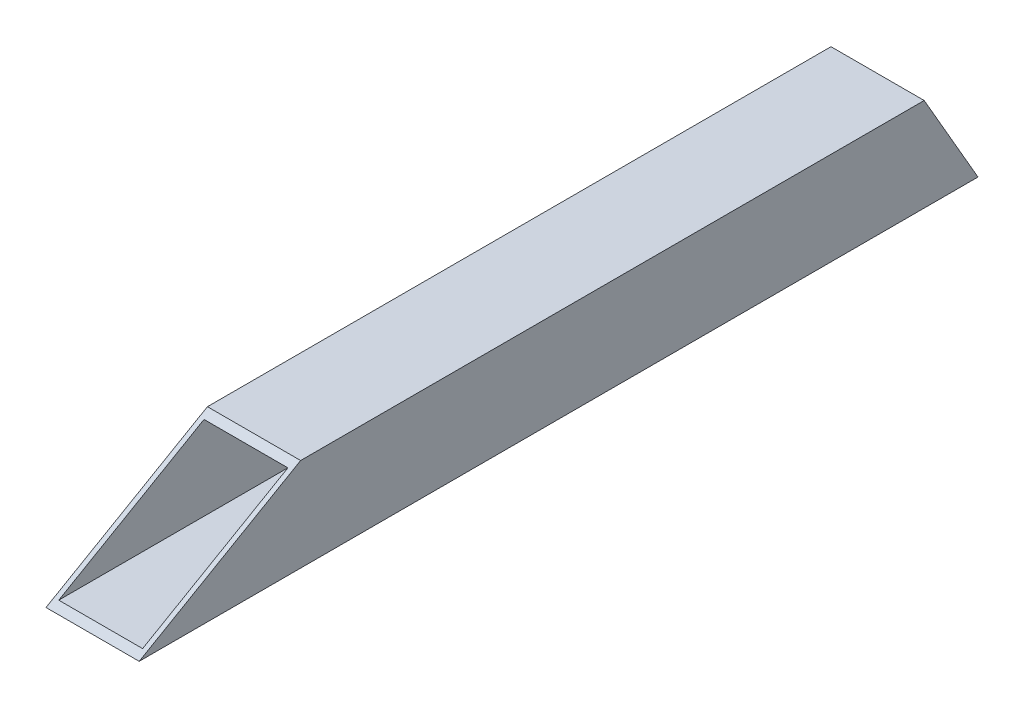
ISO-10303-21;
HEADER;
FILE_DESCRIPTION(('STEP AP214'),'2;1');
FILE_NAME('part.step','',(''),(''),'','','');
FILE_SCHEMA(('AUTOMOTIVE_DESIGN { 1 0 10303 214 1 1 1 1 }'));
ENDSEC;
DATA;
#1=APPLICATION_CONTEXT('core data for automotive mechanical design processes');
#2=APPLICATION_PROTOCOL_DEFINITION('international standard','automotive_design',2000,#1);
#3=PRODUCT_CONTEXT('',#1,'mechanical');
#4=PRODUCT('Part','Part','',(#3));
#5=PRODUCT_RELATED_PRODUCT_CATEGORY('part','',(#4));
#6=PRODUCT_DEFINITION_FORMATION('','',#4);
#7=PRODUCT_DEFINITION_CONTEXT('part definition',#1,'design');
#8=PRODUCT_DEFINITION('design','',#6,#7);
#9=PRODUCT_DEFINITION_SHAPE('','',#8);
#10=(LENGTH_UNIT() NAMED_UNIT(*) SI_UNIT(.MILLI.,.METRE.));
#11=(NAMED_UNIT(*) PLANE_ANGLE_UNIT() SI_UNIT($,.RADIAN.));
#12=(NAMED_UNIT(*) SI_UNIT($,.STERADIAN.) SOLID_ANGLE_UNIT());
#13=UNCERTAINTY_MEASURE_WITH_UNIT(LENGTH_MEASURE(1.E-05),#10,'distance_accuracy_value','');
#14=(GEOMETRIC_REPRESENTATION_CONTEXT(3) GLOBAL_UNCERTAINTY_ASSIGNED_CONTEXT((#13)) GLOBAL_UNIT_ASSIGNED_CONTEXT((#10,
#11,#12)) REPRESENTATION_CONTEXT('',''));
#15=CARTESIAN_POINT('',(0.,0.,0.));
#16=DIRECTION('',(0.,0.,1.));
#17=DIRECTION('',(1.,0.,0.));
#18=AXIS2_PLACEMENT_3D('',#15,#16,#17);
#19=CARTESIAN_POINT('',(1.,19.,180.));
#20=DIRECTION('',(0.,-1.,0.));
#21=DIRECTION('',(0.,0.,-1.));
#22=AXIS2_PLACEMENT_3D('',#19,#20,#21);
#23=PLANE('',#22);
#24=DIRECTION('',(1.,0.,0.));
#25=VECTOR('',#24,1.);
#26=CARTESIAN_POINT('',(1.,19.,147.091034656192));
#27=LINE('',#26,#25);
#28=CARTESIAN_POINT('',(1.,19.,147.091034656192));
#29=VERTEX_POINT('',#28);
#30=CARTESIAN_POINT('',(19.,19.,147.091034656192));
#31=VERTEX_POINT('',#30);
#32=EDGE_CURVE('E11',#29,#31,#27,.T.);
#33=ORIENTED_EDGE('',*,*,#32,.F.);
#34=DIRECTION('',(0.,0.,-1.));
#35=VECTOR('',#34,1.);
#36=CARTESIAN_POINT('',(1.,19.,180.));
#37=LINE('',#36,#35);
#38=CARTESIAN_POINT('',(1.,19.,10.969655114603));
#39=VERTEX_POINT('',#38);
#40=EDGE_CURVE('E143',#29,#39,#37,.T.);
#41=ORIENTED_EDGE('',*,*,#40,.T.);
#42=DIRECTION('',(-1.,0.,0.));
#43=VECTOR('',#42,1.);
#44=CARTESIAN_POINT('',(1.,19.,10.969655114603));
#45=LINE('',#44,#43);
#46=CARTESIAN_POINT('',(19.,19.,10.9696551146031));
#47=VERTEX_POINT('',#46);
#48=EDGE_CURVE('E43',#47,#39,#45,.T.);
#49=ORIENTED_EDGE('',*,*,#48,.F.);
#50=DIRECTION('',(0.,0.,-1.));
#51=VECTOR('',#50,1.);
#52=CARTESIAN_POINT('',(19.,19.,180.));
#53=LINE('',#52,#51);
#54=EDGE_CURVE('E149',#31,#47,#53,.T.);
#55=ORIENTED_EDGE('',*,*,#54,.F.);
#56=EDGE_LOOP('',(#33,#41,#49,#55));
#57=FACE_BOUND('',#56,.T.);
#58=ADVANCED_FACE('F35',(#57),#23,.T.);
#59=CARTESIAN_POINT('',(19.,1.,180.));
#60=DIRECTION('',(-1.,0.,0.));
#61=DIRECTION('',(0.,0.,1.));
#62=AXIS2_PLACEMENT_3D('',#59,#60,#61);
#63=PLANE('',#62);
#64=DIRECTION('',(0.,-0.500000000000004,0.866025403784436));
#65=VECTOR('',#64,1.);
#66=CARTESIAN_POINT('',(19.,0.250000000000004,179.566987298108));
#67=LINE('',#66,#65);
#68=CARTESIAN_POINT('',(19.,1.,178.267949192431));
#69=VERTEX_POINT('',#68);
#70=EDGE_CURVE('E173',#31,#69,#67,.T.);
#71=ORIENTED_EDGE('',*,*,#70,.F.);
#72=ORIENTED_EDGE('',*,*,#54,.T.);
#73=DIRECTION('',(0.,0.866025403784436,0.500000000000005));
#74=VECTOR('',#73,1.);
#75=CARTESIAN_POINT('',(19.,78.6922863405999,45.4330127018931));
#76=LINE('',#75,#74);
#77=CARTESIAN_POINT('',(19.,1.,0.577350269189633));
#78=VERTEX_POINT('',#77);
#79=EDGE_CURVE('E133',#78,#47,#76,.T.);
#80=ORIENTED_EDGE('',*,*,#79,.F.);
#81=DIRECTION('',(0.,0.,-1.));
#82=VECTOR('',#81,1.);
#83=CARTESIAN_POINT('',(19.,1.,180.));
#84=LINE('',#83,#82);
#85=EDGE_CURVE('E151',#69,#78,#84,.T.);
#86=ORIENTED_EDGE('',*,*,#85,.F.);
#87=EDGE_LOOP('',(#71,#72,#80,#86));
#88=FACE_BOUND('',#87,.T.);
#89=ADVANCED_FACE('F183',(#88),#63,.T.);
#90=CARTESIAN_POINT('',(1.,1.,180.));
#91=DIRECTION('',(0.,1.,0.));
#92=DIRECTION('',(0.,0.,1.));
#93=AXIS2_PLACEMENT_3D('',#90,#91,#92);
#94=PLANE('',#93);
#95=DIRECTION('',(-1.,0.,0.));
#96=VECTOR('',#95,1.);
#97=CARTESIAN_POINT('',(1.,1.,178.267949192431));
#98=LINE('',#97,#96);
#99=CARTESIAN_POINT('',(1.,1.,178.267949192431));
#100=VERTEX_POINT('',#99);
#101=EDGE_CURVE('E175',#69,#100,#98,.T.);
#102=ORIENTED_EDGE('',*,*,#101,.F.);
#103=ORIENTED_EDGE('',*,*,#85,.T.);
#104=DIRECTION('',(1.,0.,0.));
#105=VECTOR('',#104,1.);
#106=CARTESIAN_POINT('',(1.,1.,0.577350269189647));
#107=LINE('',#106,#105);
#108=CARTESIAN_POINT('',(1.,1.,0.577350269189647));
#109=VERTEX_POINT('',#108);
#110=EDGE_CURVE('E146',#109,#78,#107,.T.);
#111=ORIENTED_EDGE('',*,*,#110,.F.);
#112=DIRECTION('',(0.,0.,-1.));
#113=VECTOR('',#112,1.);
#114=CARTESIAN_POINT('',(1.,1.,180.));
#115=LINE('',#114,#113);
#116=EDGE_CURVE('E145',#100,#109,#115,.T.);
#117=ORIENTED_EDGE('',*,*,#116,.F.);
#118=EDGE_LOOP('',(#102,#103,#111,#117));
#119=FACE_BOUND('',#118,.T.);
#120=ADVANCED_FACE('F180',(#119),#94,.T.);
#121=CARTESIAN_POINT('',(1.,1.,180.));
#122=DIRECTION('',(1.,0.,0.));
#123=DIRECTION('',(0.,0.,-1.));
#124=AXIS2_PLACEMENT_3D('',#121,#122,#123);
#125=PLANE('',#124);
#126=DIRECTION('',(0.,0.500000000000004,-0.866025403784436));
#127=VECTOR('',#126,1.);
#128=CARTESIAN_POINT('',(1.,0.250000000000004,179.566987298108));
#129=LINE('',#128,#127);
#130=EDGE_CURVE('E153',#100,#29,#129,.T.);
#131=ORIENTED_EDGE('',*,*,#130,.F.);
#132=ORIENTED_EDGE('',*,*,#116,.T.);
#133=DIRECTION('',(0.,-0.866025403784436,-0.500000000000005));
#134=VECTOR('',#133,1.);
#135=CARTESIAN_POINT('',(1.,78.6922863405999,45.4330127018931));
#136=LINE('',#135,#134);
#137=EDGE_CURVE('E130',#39,#109,#136,.T.);
#138=ORIENTED_EDGE('',*,*,#137,.F.);
#139=ORIENTED_EDGE('',*,*,#40,.F.);
#140=EDGE_LOOP('',(#131,#132,#138,#139));
#141=FACE_BOUND('',#140,.T.);
#142=ADVANCED_FACE('F142',(#141),#125,.T.);
#143=CARTESIAN_POINT('',(-230.,0.,0.));
#144=DIRECTION('',(0.,-0.500000000000005,0.866025403784436));
#145=DIRECTION('',(0.,-0.866025403784436,-0.500000000000005));
#146=AXIS2_PLACEMENT_3D('',#143,#144,#145);
#147=PLANE('',#146);
#148=ORIENTED_EDGE('',*,*,#137,.T.);
#149=ORIENTED_EDGE('',*,*,#110,.T.);
#150=ORIENTED_EDGE('',*,*,#79,.T.);
#151=ORIENTED_EDGE('',*,*,#48,.T.);
#152=EDGE_LOOP('',(#148,#149,#150,#151));
#153=FACE_BOUND('',#152,.T.);
#154=DIRECTION('',(1.,0.,0.));
#155=VECTOR('',#154,1.);
#156=CARTESIAN_POINT('',(-230.,20.,11.5470053837927));
#157=LINE('',#156,#155);
#158=CARTESIAN_POINT('',(0.,20.,11.5470053837927));
#159=VERTEX_POINT('',#158);
#160=CARTESIAN_POINT('',(20.,20.,11.5470053837927));
#161=VERTEX_POINT('',#160);
#162=EDGE_CURVE('E117',#159,#161,#157,.T.);
#163=ORIENTED_EDGE('',*,*,#162,.T.);
#164=DIRECTION('',(0.,-0.866025403784436,-0.500000000000005));
#165=VECTOR('',#164,1.);
#166=CARTESIAN_POINT('',(20.,0.,0.));
#167=LINE('',#166,#165);
#168=CARTESIAN_POINT('',(20.,0.,0.));
#169=VERTEX_POINT('',#168);
#170=EDGE_CURVE('E165',#161,#169,#167,.T.);
#171=ORIENTED_EDGE('',*,*,#170,.T.);
#172=DIRECTION('',(1.,0.,0.));
#173=VECTOR('',#172,1.);
#174=CARTESIAN_POINT('',(0.,0.,0.));
#175=LINE('',#174,#173);
#176=CARTESIAN_POINT('',(0.,0.,0.));
#177=VERTEX_POINT('',#176);
#178=EDGE_CURVE('E106',#177,#169,#175,.T.);
#179=ORIENTED_EDGE('',*,*,#178,.F.);
#180=DIRECTION('',(0.,-0.866025403784436,-0.500000000000005));
#181=VECTOR('',#180,1.);
#182=CARTESIAN_POINT('',(0.,77.9422863405999,45.0000000000008));
#183=LINE('',#182,#181);
#184=EDGE_CURVE('E58',#159,#177,#183,.T.);
#185=ORIENTED_EDGE('',*,*,#184,.F.);
#186=EDGE_LOOP('',(#163,#171,#179,#185));
#187=FACE_BOUND('',#186,.T.);
#188=ADVANCED_FACE('F129',(#153,#187),#147,.F.);
#189=CARTESIAN_POINT('',(-230.,0.,180.));
#190=DIRECTION('',(0.,-0.866025403784436,-0.500000000000004));
#191=DIRECTION('',(0.,0.500000000000004,-0.866025403784436));
#192=AXIS2_PLACEMENT_3D('',#189,#190,#191);
#193=PLANE('',#192);
#194=ORIENTED_EDGE('',*,*,#130,.T.);
#195=ORIENTED_EDGE('',*,*,#32,.T.);
#196=ORIENTED_EDGE('',*,*,#70,.T.);
#197=ORIENTED_EDGE('',*,*,#101,.T.);
#198=EDGE_LOOP('',(#194,#195,#196,#197));
#199=FACE_BOUND('',#198,.T.);
#200=DIRECTION('',(1.,0.,0.));
#201=VECTOR('',#200,1.);
#202=CARTESIAN_POINT('',(0.,0.,180.));
#203=LINE('',#202,#201);
#204=CARTESIAN_POINT('',(0.,0.,180.));
#205=VERTEX_POINT('',#204);
#206=CARTESIAN_POINT('',(20.,0.,180.));
#207=VERTEX_POINT('',#206);
#208=EDGE_CURVE('E97',#205,#207,#203,.T.);
#209=ORIENTED_EDGE('',*,*,#208,.T.);
#210=DIRECTION('',(0.,0.500000000000004,-0.866025403784436));
#211=VECTOR('',#210,1.);
#212=CARTESIAN_POINT('',(20.,0.,180.));
#213=LINE('',#212,#211);
#214=CARTESIAN_POINT('',(20.,20.,145.358983848623));
#215=VERTEX_POINT('',#214);
#216=EDGE_CURVE('E50',#207,#215,#213,.T.);
#217=ORIENTED_EDGE('',*,*,#216,.T.);
#218=DIRECTION('',(1.,0.,0.));
#219=VECTOR('',#218,1.);
#220=CARTESIAN_POINT('',(-230.,20.,145.358983848623));
#221=LINE('',#220,#219);
#222=CARTESIAN_POINT('',(0.,20.,145.358983848623));
#223=VERTEX_POINT('',#222);
#224=EDGE_CURVE('E116',#223,#215,#221,.T.);
#225=ORIENTED_EDGE('',*,*,#224,.F.);
#226=DIRECTION('',(0.,0.500000000000004,-0.866025403784436));
#227=VECTOR('',#226,1.);
#228=CARTESIAN_POINT('',(0.,0.,180.));
#229=LINE('',#228,#227);
#230=EDGE_CURVE('E100',#205,#223,#229,.T.);
#231=ORIENTED_EDGE('',*,*,#230,.F.);
#232=EDGE_LOOP('',(#209,#217,#225,#231));
#233=FACE_BOUND('',#232,.T.);
#234=ADVANCED_FACE('F98',(#199,#233),#193,.F.);
#235=CARTESIAN_POINT('',(0.,0.,180.));
#236=DIRECTION('',(1.,0.,0.));
#237=DIRECTION('',(0.,0.,-1.));
#238=AXIS2_PLACEMENT_3D('',#235,#236,#237);
#239=PLANE('',#238);
#240=DIRECTION('',(0.,0.,-1.));
#241=VECTOR('',#240,1.);
#242=CARTESIAN_POINT('',(0.,0.,180.));
#243=LINE('',#242,#241);
#244=EDGE_CURVE('E121',#205,#177,#243,.T.);
#245=ORIENTED_EDGE('',*,*,#244,.F.);
#246=ORIENTED_EDGE('',*,*,#230,.T.);
#247=DIRECTION('',(0.,0.,-1.));
#248=VECTOR('',#247,1.);
#249=CARTESIAN_POINT('',(0.,20.,180.));
#250=LINE('',#249,#248);
#251=EDGE_CURVE('E105',#223,#159,#250,.T.);
#252=ORIENTED_EDGE('',*,*,#251,.T.);
#253=ORIENTED_EDGE('',*,*,#184,.T.);
#254=EDGE_LOOP('',(#245,#246,#252,#253));
#255=FACE_BOUND('',#254,.T.);
#256=ADVANCED_FACE('F37',(#255),#239,.F.);
#257=CARTESIAN_POINT('',(0.,0.,180.));
#258=DIRECTION('',(0.,1.,0.));
#259=DIRECTION('',(0.,0.,1.));
#260=AXIS2_PLACEMENT_3D('',#257,#258,#259);
#261=PLANE('',#260);
#262=ORIENTED_EDGE('',*,*,#178,.T.);
#263=DIRECTION('',(0.,0.,-1.));
#264=VECTOR('',#263,1.);
#265=CARTESIAN_POINT('',(20.,0.,180.));
#266=LINE('',#265,#264);
#267=EDGE_CURVE('E113',#207,#169,#266,.T.);
#268=ORIENTED_EDGE('',*,*,#267,.F.);
#269=ORIENTED_EDGE('',*,*,#208,.F.);
#270=ORIENTED_EDGE('',*,*,#244,.T.);
#271=EDGE_LOOP('',(#262,#268,#269,#270));
#272=FACE_BOUND('',#271,.T.);
#273=ADVANCED_FACE('F120',(#272),#261,.F.);
#274=CARTESIAN_POINT('',(20.,0.,180.));
#275=DIRECTION('',(-1.,0.,0.));
#276=DIRECTION('',(0.,0.,1.));
#277=AXIS2_PLACEMENT_3D('',#274,#275,#276);
#278=PLANE('',#277);
#279=DIRECTION('',(0.,0.,-1.));
#280=VECTOR('',#279,1.);
#281=CARTESIAN_POINT('',(20.,20.,180.));
#282=LINE('',#281,#280);
#283=EDGE_CURVE('E115',#215,#161,#282,.T.);
#284=ORIENTED_EDGE('',*,*,#283,.F.);
#285=ORIENTED_EDGE('',*,*,#216,.F.);
#286=ORIENTED_EDGE('',*,*,#267,.T.);
#287=ORIENTED_EDGE('',*,*,#170,.F.);
#288=EDGE_LOOP('',(#284,#285,#286,#287));
#289=FACE_BOUND('',#288,.T.);
#290=ADVANCED_FACE('F111',(#289),#278,.F.);
#291=CARTESIAN_POINT('',(0.,20.,180.));
#292=DIRECTION('',(0.,-1.,0.));
#293=DIRECTION('',(0.,0.,-1.));
#294=AXIS2_PLACEMENT_3D('',#291,#292,#293);
#295=PLANE('',#294);
#296=ORIENTED_EDGE('',*,*,#251,.F.);
#297=ORIENTED_EDGE('',*,*,#224,.T.);
#298=ORIENTED_EDGE('',*,*,#283,.T.);
#299=ORIENTED_EDGE('',*,*,#162,.F.);
#300=EDGE_LOOP('',(#296,#297,#298,#299));
#301=FACE_BOUND('',#300,.T.);
#302=ADVANCED_FACE('F164',(#301),#295,.F.);
#303=CLOSED_SHELL('',(#58,#89,#120,#142,#188,#234,#256,#273,#290,#302));
#304=MANIFOLD_SOLID_BREP('B2',#303);
#305=ADVANCED_BREP_SHAPE_REPRESENTATION('',(#18,#304),#14);
#306=SHAPE_DEFINITION_REPRESENTATION(#9,#305);
ENDSEC;
END-ISO-10303-21;
